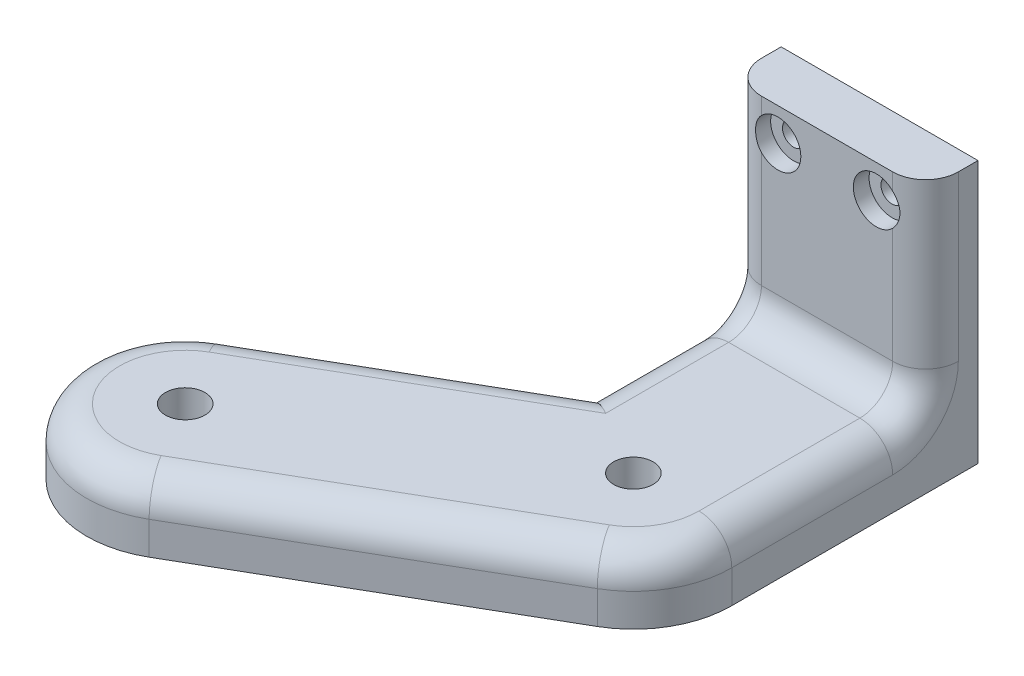
ISO-10303-21;
HEADER;
FILE_DESCRIPTION(('STEP AP214'),'2;1');
FILE_NAME('part.step','',(''),(''),'','','');
FILE_SCHEMA(('AUTOMOTIVE_DESIGN { 1 0 10303 214 1 1 1 1 }'));
ENDSEC;
DATA;
#1=APPLICATION_CONTEXT('core data for automotive mechanical design processes');
#2=APPLICATION_PROTOCOL_DEFINITION('international standard','automotive_design',2000,#1);
#3=PRODUCT_CONTEXT('',#1,'mechanical');
#4=PRODUCT('Part','Part','',(#3));
#5=PRODUCT_RELATED_PRODUCT_CATEGORY('part','',(#4));
#6=PRODUCT_DEFINITION_FORMATION('','',#4);
#7=PRODUCT_DEFINITION_CONTEXT('part definition',#1,'design');
#8=PRODUCT_DEFINITION('design','',#6,#7);
#9=PRODUCT_DEFINITION_SHAPE('','',#8);
#10=(LENGTH_UNIT() NAMED_UNIT(*) SI_UNIT(.MILLI.,.METRE.));
#11=(NAMED_UNIT(*) PLANE_ANGLE_UNIT() SI_UNIT($,.RADIAN.));
#12=(NAMED_UNIT(*) SI_UNIT($,.STERADIAN.) SOLID_ANGLE_UNIT());
#13=UNCERTAINTY_MEASURE_WITH_UNIT(LENGTH_MEASURE(1.E-05),#10,'distance_accuracy_value','');
#14=(GEOMETRIC_REPRESENTATION_CONTEXT(3) GLOBAL_UNCERTAINTY_ASSIGNED_CONTEXT((#13)) GLOBAL_UNIT_ASSIGNED_CONTEXT((#10,
#11,#12)) REPRESENTATION_CONTEXT('',''));
#15=CARTESIAN_POINT('',(0.,0.,0.));
#16=DIRECTION('',(0.,0.,1.));
#17=DIRECTION('',(1.,0.,0.));
#18=AXIS2_PLACEMENT_3D('',#15,#16,#17);
#19=CARTESIAN_POINT('',(0.,5.,37.5217));
#20=DIRECTION('',(0.,-1.,0.));
#21=DIRECTION('',(0.,0.,-1.));
#22=AXIS2_PLACEMENT_3D('',#19,#20,#21);
#23=CYLINDRICAL_SURFACE('',#22,2.99999999999999);
#24=CARTESIAN_POINT('',(0.,5.,37.5217));
#25=DIRECTION('',(0.,1.,0.));
#26=DIRECTION('',(0.,0.,1.));
#27=AXIS2_PLACEMENT_3D('',#24,#25,#26);
#28=CIRCLE('',#27,2.99999999999999);
#29=CARTESIAN_POINT('',(0.,5.,40.5217));
#30=VERTEX_POINT('',#29);
#31=EDGE_CURVE('E200',#30,#30,#28,.T.);
#32=ORIENTED_EDGE('',*,*,#31,.T.);
#33=EDGE_LOOP('',(#32));
#34=FACE_BOUND('',#33,.T.);
#35=CARTESIAN_POINT('',(0.,0.,37.5217));
#36=DIRECTION('',(0.,-1.,0.));
#37=DIRECTION('',(0.,0.,-1.));
#38=AXIS2_PLACEMENT_3D('',#35,#36,#37);
#39=CIRCLE('',#38,2.99999999999999);
#40=CARTESIAN_POINT('',(0.,0.,34.5217));
#41=VERTEX_POINT('',#40);
#42=EDGE_CURVE('E234',#41,#41,#39,.T.);
#43=ORIENTED_EDGE('',*,*,#42,.T.);
#44=EDGE_LOOP('',(#43));
#45=FACE_BOUND('',#44,.T.);
#46=ADVANCED_FACE('F39',(#34,#45),#23,.F.);
#47=CARTESIAN_POINT('',(-43.3012701892221,5.,62.5216999999997));
#48=DIRECTION('',(0.,1.,0.));
#49=DIRECTION('',(0.,0.,1.));
#50=AXIS2_PLACEMENT_3D('',#47,#48,#49);
#51=PLANE('',#50);
#52=DIRECTION('',(0.,0.,-1.));
#53=VECTOR('',#52,1.);
#54=CARTESIAN_POINT('',(9.99999999999999,5.,8.));
#55=LINE('',#54,#53);
#56=CARTESIAN_POINT('',(9.99999999999999,5.,37.5217));
#57=VERTEX_POINT('',#56);
#58=CARTESIAN_POINT('',(9.99999999999999,5.,13.));
#59=VERTEX_POINT('',#58);
#60=EDGE_CURVE('E354',#57,#59,#55,.T.);
#61=ORIENTED_EDGE('',*,*,#60,.T.);
#62=DIRECTION('',(-1.,0.,0.));
#63=VECTOR('',#62,1.);
#64=CARTESIAN_POINT('',(-15.,5.,13.));
#65=LINE('',#64,#63);
#66=CARTESIAN_POINT('',(-10.,5.,13.));
#67=VERTEX_POINT('',#66);
#68=EDGE_CURVE('E468',#59,#67,#65,.T.);
#69=ORIENTED_EDGE('',*,*,#68,.T.);
#70=DIRECTION('',(0.,0.,1.));
#71=VECTOR('',#70,1.);
#72=CARTESIAN_POINT('',(-10.,5.,28.8614459621556));
#73=LINE('',#72,#71);
#74=CARTESIAN_POINT('',(-10.,5.,31.7481973081037));
#75=VERTEX_POINT('',#74);
#76=EDGE_CURVE('E477',#67,#75,#73,.T.);
#77=ORIENTED_EDGE('',*,*,#76,.T.);
#78=DIRECTION('',(-0.866025403784441,0.,0.499999999999995));
#79=VECTOR('',#78,1.);
#80=CARTESIAN_POINT('',(-48.301270189222,5.,53.8614459621553));
#81=LINE('',#80,#79);
#82=CARTESIAN_POINT('',(-48.301270189222,5.,53.8614459621553));
#83=VERTEX_POINT('',#82);
#84=EDGE_CURVE('E479',#75,#83,#81,.T.);
#85=ORIENTED_EDGE('',*,*,#84,.T.);
#86=CARTESIAN_POINT('',(-43.3012701892221,5.,62.5216999999997));
#87=DIRECTION('',(0.,1.,0.));
#88=DIRECTION('',(0.,0.,1.));
#89=AXIS2_PLACEMENT_3D('',#86,#87,#88);
#90=CIRCLE('',#89,9.99999999999999);
#91=CARTESIAN_POINT('',(-38.3012701892221,5.,71.1819540378442));
#92=VERTEX_POINT('',#91);
#93=EDGE_CURVE('E482',#83,#92,#90,.T.);
#94=ORIENTED_EDGE('',*,*,#93,.T.);
#95=DIRECTION('',(0.866025403784442,0.,-0.499999999999995));
#96=VECTOR('',#95,1.);
#97=CARTESIAN_POINT('',(4.99999999999996,5.,46.1819540378444));
#98=LINE('',#97,#96);
#99=CARTESIAN_POINT('',(4.99999999999994,5.,46.1819540378444));
#100=VERTEX_POINT('',#99);
#101=EDGE_CURVE('E484',#92,#100,#98,.T.);
#102=ORIENTED_EDGE('',*,*,#101,.T.);
#103=CARTESIAN_POINT('',(0.,5.,37.5217));
#104=DIRECTION('',(0.,1.,0.));
#105=DIRECTION('',(0.,0.,1.));
#106=AXIS2_PLACEMENT_3D('',#103,#104,#105);
#107=CIRCLE('',#106,9.99999999999998);
#108=EDGE_CURVE('E434',#100,#57,#107,.T.);
#109=ORIENTED_EDGE('',*,*,#108,.T.);
#110=EDGE_LOOP('',(#61,#69,#77,#85,#94,#102,#109));
#111=FACE_BOUND('',#110,.T.);
#112=ORIENTED_EDGE('',*,*,#31,.F.);
#113=EDGE_LOOP('',(#112));
#114=FACE_BOUND('',#113,.T.);
#115=CARTESIAN_POINT('',(-43.3012701892221,5.,62.5216999999997));
#116=DIRECTION('',(0.,1.,0.));
#117=DIRECTION('',(0.,0.,1.));
#118=AXIS2_PLACEMENT_3D('',#115,#116,#117);
#119=CIRCLE('',#118,3.);
#120=CARTESIAN_POINT('',(-43.3012701892221,5.,65.5216999999998));
#121=VERTEX_POINT('',#120);
#122=EDGE_CURVE('E197',#121,#121,#119,.T.);
#123=ORIENTED_EDGE('',*,*,#122,.F.);
#124=EDGE_LOOP('',(#123));
#125=FACE_BOUND('',#124,.T.);
#126=ADVANCED_FACE('F299',(#111,#114,#125),#51,.T.);
#127=CARTESIAN_POINT('',(-43.3012701892221,-5.,62.5216999999997));
#128=DIRECTION('',(0.,1.,0.));
#129=DIRECTION('',(0.,0.,1.));
#130=AXIS2_PLACEMENT_3D('',#127,#128,#129);
#131=PLANE('',#130);
#132=CARTESIAN_POINT('',(0.,-5.,37.5217));
#133=DIRECTION('',(0.,-1.,0.));
#134=DIRECTION('',(0.,0.,-1.));
#135=AXIS2_PLACEMENT_3D('',#132,#133,#134);
#136=CIRCLE('',#135,6.5);
#137=CARTESIAN_POINT('',(0.,-5.,31.0217));
#138=VERTEX_POINT('',#137);
#139=EDGE_CURVE('E379',#138,#138,#136,.T.);
#140=ORIENTED_EDGE('',*,*,#139,.F.);
#141=EDGE_LOOP('',(#140));
#142=FACE_BOUND('',#141,.T.);
#143=DIRECTION('',(0.,0.,-1.));
#144=VECTOR('',#143,1.);
#145=CARTESIAN_POINT('',(15.,-5.,37.5217));
#146=LINE('',#145,#144);
#147=CARTESIAN_POINT('',(15.,-5.,37.5217));
#148=VERTEX_POINT('',#147);
#149=CARTESIAN_POINT('',(15.,-5.,0.));
#150=VERTEX_POINT('',#149);
#151=EDGE_CURVE('E205',#148,#150,#146,.T.);
#152=ORIENTED_EDGE('',*,*,#151,.F.);
#153=CARTESIAN_POINT('',(0.,-5.,37.5217));
#154=DIRECTION('',(0.,1.,0.));
#155=DIRECTION('',(0.,0.,1.));
#156=AXIS2_PLACEMENT_3D('',#153,#154,#155);
#157=CIRCLE('',#156,15.);
#158=CARTESIAN_POINT('',(7.49999999999992,-5.,50.5120810567666));
#159=VERTEX_POINT('',#158);
#160=EDGE_CURVE('E220',#159,#148,#157,.T.);
#161=ORIENTED_EDGE('',*,*,#160,.F.);
#162=DIRECTION('',(0.866025403784442,0.,-0.499999999999995));
#163=VECTOR('',#162,1.);
#164=CARTESIAN_POINT('',(7.49999999999992,-5.,50.5120810567666));
#165=LINE('',#164,#163);
#166=CARTESIAN_POINT('',(-35.8012701892222,-5.,75.5120810567664));
#167=VERTEX_POINT('',#166);
#168=EDGE_CURVE('E217',#167,#159,#165,.T.);
#169=ORIENTED_EDGE('',*,*,#168,.F.);
#170=CARTESIAN_POINT('',(-43.3012701892221,-5.,62.5216999999997));
#171=DIRECTION('',(0.,1.,0.));
#172=DIRECTION('',(0.,0.,1.));
#173=AXIS2_PLACEMENT_3D('',#170,#171,#172);
#174=CIRCLE('',#173,15.);
#175=CARTESIAN_POINT('',(-50.801270189222,-5.,49.5313189432331));
#176=VERTEX_POINT('',#175);
#177=EDGE_CURVE('E214',#176,#167,#174,.T.);
#178=ORIENTED_EDGE('',*,*,#177,.F.);
#179=DIRECTION('',(-0.866025403784441,0.,0.499999999999995));
#180=VECTOR('',#179,1.);
#181=CARTESIAN_POINT('',(-15.,-5.,28.8614459621556));
#182=LINE('',#181,#180);
#183=CARTESIAN_POINT('',(-15.,-5.,28.8614459621556));
#184=VERTEX_POINT('',#183);
#185=EDGE_CURVE('E211',#184,#176,#182,.T.);
#186=ORIENTED_EDGE('',*,*,#185,.F.);
#187=DIRECTION('',(0.,0.,1.));
#188=VECTOR('',#187,1.);
#189=CARTESIAN_POINT('',(-15.,-5.,0.));
#190=LINE('',#189,#188);
#191=CARTESIAN_POINT('',(-15.,-5.,0.));
#192=VERTEX_POINT('',#191);
#193=EDGE_CURVE('E209',#192,#184,#190,.T.);
#194=ORIENTED_EDGE('',*,*,#193,.F.);
#195=DIRECTION('',(-1.,0.,0.));
#196=VECTOR('',#195,1.);
#197=CARTESIAN_POINT('',(-15.,-5.,0.));
#198=LINE('',#197,#196);
#199=EDGE_CURVE('E180',#150,#192,#198,.T.);
#200=ORIENTED_EDGE('',*,*,#199,.F.);
#201=EDGE_LOOP('',(#152,#161,#169,#178,#186,#194,#200));
#202=FACE_BOUND('',#201,.T.);
#203=CARTESIAN_POINT('',(-43.3012701892221,-5.,62.5216999999997));
#204=DIRECTION('',(0.,1.,0.));
#205=DIRECTION('',(0.,0.,1.));
#206=AXIS2_PLACEMENT_3D('',#203,#204,#205);
#207=CIRCLE('',#206,3.);
#208=CARTESIAN_POINT('',(-43.3012701892221,-5.,65.5216999999998));
#209=VERTEX_POINT('',#208);
#210=EDGE_CURVE('E195',#209,#209,#207,.T.);
#211=ORIENTED_EDGE('',*,*,#210,.T.);
#212=EDGE_LOOP('',(#211));
#213=FACE_BOUND('',#212,.T.);
#214=ADVANCED_FACE('F303',(#142,#202,#213),#131,.F.);
#215=CARTESIAN_POINT('',(15.,5.,37.5217));
#216=DIRECTION('',(-1.,0.,0.));
#217=DIRECTION('',(0.,0.,1.));
#218=AXIS2_PLACEMENT_3D('',#215,#216,#217);
#219=PLANE('',#218);
#220=DIRECTION('',(0.,0.,-1.));
#221=VECTOR('',#220,1.);
#222=CARTESIAN_POINT('',(15.,35.,8.));
#223=LINE('',#222,#221);
#224=CARTESIAN_POINT('',(15.,35.,3.));
#225=VERTEX_POINT('',#224);
#226=CARTESIAN_POINT('',(15.,35.,0.));
#227=VERTEX_POINT('',#226);
#228=EDGE_CURVE('E172',#225,#227,#223,.T.);
#229=ORIENTED_EDGE('',*,*,#228,.F.);
#230=DIRECTION('',(0.,-1.,0.));
#231=VECTOR('',#230,1.);
#232=CARTESIAN_POINT('',(15.,5.,3.));
#233=LINE('',#232,#231);
#234=CARTESIAN_POINT('',(15.,10.,3.));
#235=VERTEX_POINT('',#234);
#236=EDGE_CURVE('E243',#225,#235,#233,.T.);
#237=ORIENTED_EDGE('',*,*,#236,.T.);
#238=CARTESIAN_POINT('',(15.,10.,13.));
#239=DIRECTION('',(-1.,0.,0.));
#240=DIRECTION('',(0.,0.,1.));
#241=AXIS2_PLACEMENT_3D('',#238,#239,#240);
#242=CIRCLE('',#241,10.);
#243=CARTESIAN_POINT('',(15.,0.,13.));
#244=VERTEX_POINT('',#243);
#245=EDGE_CURVE('E240',#244,#235,#242,.F.);
#246=ORIENTED_EDGE('',*,*,#245,.F.);
#247=DIRECTION('',(0.,0.,-1.));
#248=VECTOR('',#247,1.);
#249=CARTESIAN_POINT('',(15.,0.,37.5217));
#250=LINE('',#249,#248);
#251=CARTESIAN_POINT('',(15.,0.,37.5217));
#252=VERTEX_POINT('',#251);
#253=EDGE_CURVE('E233',#244,#252,#250,.F.);
#254=ORIENTED_EDGE('',*,*,#253,.T.);
#255=DIRECTION('',(0.,-1.,0.));
#256=VECTOR('',#255,1.);
#257=CARTESIAN_POINT('',(15.,5.,37.5217));
#258=LINE('',#257,#256);
#259=EDGE_CURVE('E223',#252,#148,#258,.T.);
#260=ORIENTED_EDGE('',*,*,#259,.T.);
#261=ORIENTED_EDGE('',*,*,#151,.T.);
#262=DIRECTION('',(0.,-1.,0.));
#263=VECTOR('',#262,1.);
#264=CARTESIAN_POINT('',(15.,5.,0.));
#265=LINE('',#264,#263);
#266=EDGE_CURVE('E181',#227,#150,#265,.T.);
#267=ORIENTED_EDGE('',*,*,#266,.F.);
#268=EDGE_LOOP('',(#229,#237,#246,#254,#260,#261,#267));
#269=FACE_BOUND('',#268,.T.);
#270=ADVANCED_FACE('F307',(#269),#219,.F.);
#271=CARTESIAN_POINT('',(-15.,5.,0.));
#272=DIRECTION('',(0.,0.,1.));
#273=DIRECTION('',(1.,0.,0.));
#274=AXIS2_PLACEMENT_3D('',#271,#272,#273);
#275=PLANE('',#274);
#276=CARTESIAN_POINT('',(-7.5,30.,0.));
#277=DIRECTION('',(0.,0.,1.));
#278=DIRECTION('',(1.,0.,0.));
#279=AXIS2_PLACEMENT_3D('',#276,#277,#278);
#280=CIRCLE('',#279,1.7);
#281=CARTESIAN_POINT('',(-5.8,30.,0.));
#282=VERTEX_POINT('',#281);
#283=EDGE_CURVE('E400',#282,#282,#280,.T.);
#284=ORIENTED_EDGE('',*,*,#283,.T.);
#285=EDGE_LOOP('',(#284));
#286=FACE_BOUND('',#285,.T.);
#287=CARTESIAN_POINT('',(7.5,30.,0.));
#288=DIRECTION('',(0.,0.,1.));
#289=DIRECTION('',(1.,0.,0.));
#290=AXIS2_PLACEMENT_3D('',#287,#288,#289);
#291=CIRCLE('',#290,1.7);
#292=CARTESIAN_POINT('',(9.2,30.,0.));
#293=VERTEX_POINT('',#292);
#294=EDGE_CURVE('E188',#293,#293,#291,.T.);
#295=ORIENTED_EDGE('',*,*,#294,.T.);
#296=EDGE_LOOP('',(#295));
#297=FACE_BOUND('',#296,.T.);
#298=ORIENTED_EDGE('',*,*,#199,.T.);
#299=DIRECTION('',(0.,-1.,0.));
#300=VECTOR('',#299,1.);
#301=CARTESIAN_POINT('',(-15.,5.,0.));
#302=LINE('',#301,#300);
#303=CARTESIAN_POINT('',(-15.,35.,0.));
#304=VERTEX_POINT('',#303);
#305=EDGE_CURVE('E165',#304,#192,#302,.T.);
#306=ORIENTED_EDGE('',*,*,#305,.F.);
#307=DIRECTION('',(1.,0.,0.));
#308=VECTOR('',#307,1.);
#309=CARTESIAN_POINT('',(15.,35.,0.));
#310=LINE('',#309,#308);
#311=EDGE_CURVE('E179',#304,#227,#310,.T.);
#312=ORIENTED_EDGE('',*,*,#311,.T.);
#313=ORIENTED_EDGE('',*,*,#266,.T.);
#314=EDGE_LOOP('',(#298,#306,#312,#313));
#315=FACE_BOUND('',#314,.T.);
#316=ADVANCED_FACE('F177',(#286,#297,#315),#275,.F.);
#317=CARTESIAN_POINT('',(-15.,5.,0.));
#318=DIRECTION('',(1.,0.,0.));
#319=DIRECTION('',(0.,0.,-1.));
#320=AXIS2_PLACEMENT_3D('',#317,#318,#319);
#321=PLANE('',#320);
#322=CARTESIAN_POINT('',(-15.,10.,13.));
#323=DIRECTION('',(1.,0.,0.));
#324=DIRECTION('',(0.,0.,-1.));
#325=AXIS2_PLACEMENT_3D('',#322,#323,#324);
#326=CIRCLE('',#325,10.);
#327=CARTESIAN_POINT('',(-15.,10.,3.));
#328=VERTEX_POINT('',#327);
#329=CARTESIAN_POINT('',(-15.,0.,13.));
#330=VERTEX_POINT('',#329);
#331=EDGE_CURVE('E419',#328,#330,#326,.F.);
#332=ORIENTED_EDGE('',*,*,#331,.F.);
#333=DIRECTION('',(0.,1.,0.));
#334=VECTOR('',#333,1.);
#335=CARTESIAN_POINT('',(-15.,35.,3.));
#336=LINE('',#335,#334);
#337=CARTESIAN_POINT('',(-15.,35.,3.));
#338=VERTEX_POINT('',#337);
#339=EDGE_CURVE('E168',#328,#338,#336,.T.);
#340=ORIENTED_EDGE('',*,*,#339,.T.);
#341=DIRECTION('',(0.,0.,-1.));
#342=VECTOR('',#341,1.);
#343=CARTESIAN_POINT('',(-15.,35.,8.));
#344=LINE('',#343,#342);
#345=EDGE_CURVE('E161',#338,#304,#344,.T.);
#346=ORIENTED_EDGE('',*,*,#345,.T.);
#347=ORIENTED_EDGE('',*,*,#305,.T.);
#348=ORIENTED_EDGE('',*,*,#193,.T.);
#349=DIRECTION('',(0.,-1.,0.));
#350=VECTOR('',#349,1.);
#351=CARTESIAN_POINT('',(-15.,5.,28.8614459621556));
#352=LINE('',#351,#350);
#353=CARTESIAN_POINT('',(-15.,0.,28.8614459621556));
#354=VERTEX_POINT('',#353);
#355=EDGE_CURVE('E182',#354,#184,#352,.T.);
#356=ORIENTED_EDGE('',*,*,#355,.F.);
#357=DIRECTION('',(0.,0.,1.));
#358=VECTOR('',#357,1.);
#359=CARTESIAN_POINT('',(-15.,0.,8.));
#360=LINE('',#359,#358);
#361=EDGE_CURVE('E421',#354,#330,#360,.F.);
#362=ORIENTED_EDGE('',*,*,#361,.T.);
#363=EDGE_LOOP('',(#332,#340,#346,#347,#348,#356,#362));
#364=FACE_BOUND('',#363,.T.);
#365=ADVANCED_FACE('F163',(#364),#321,.F.);
#366=CARTESIAN_POINT('',(-15.,5.,28.8614459621556));
#367=DIRECTION('',(0.499999999999995,0.,0.866025403784441));
#368=DIRECTION('',(0.866025403784441,0.,-0.499999999999995));
#369=AXIS2_PLACEMENT_3D('',#366,#367,#368);
#370=PLANE('',#369);
#371=DIRECTION('',(0.,-1.,0.));
#372=VECTOR('',#371,1.);
#373=CARTESIAN_POINT('',(-50.801270189222,5.,49.5313189432331));
#374=LINE('',#373,#372);
#375=CARTESIAN_POINT('',(-50.801270189222,0.,49.5313189432331));
#376=VERTEX_POINT('',#375);
#377=EDGE_CURVE('E229',#376,#176,#374,.T.);
#378=ORIENTED_EDGE('',*,*,#377,.F.);
#379=DIRECTION('',(-0.866025403784441,0.,0.499999999999995));
#380=VECTOR('',#379,1.);
#381=CARTESIAN_POINT('',(-15.,0.,28.8614459621556));
#382=LINE('',#381,#380);
#383=EDGE_CURVE('E474',#376,#354,#382,.F.);
#384=ORIENTED_EDGE('',*,*,#383,.T.);
#385=ORIENTED_EDGE('',*,*,#355,.T.);
#386=ORIENTED_EDGE('',*,*,#185,.T.);
#387=EDGE_LOOP('',(#378,#384,#385,#386));
#388=FACE_BOUND('',#387,.T.);
#389=ADVANCED_FACE('F317',(#388),#370,.F.);
#390=CARTESIAN_POINT('',(-43.3012701892221,5.,62.5216999999997));
#391=DIRECTION('',(0.,-1.,0.));
#392=DIRECTION('',(0.,0.,-1.));
#393=AXIS2_PLACEMENT_3D('',#390,#391,#392);
#394=CYLINDRICAL_SURFACE('',#393,15.);
#395=DIRECTION('',(0.,-1.,0.));
#396=VECTOR('',#395,1.);
#397=CARTESIAN_POINT('',(-35.8012701892222,5.,75.5120810567664));
#398=LINE('',#397,#396);
#399=CARTESIAN_POINT('',(-35.8012701892222,0.,75.5120810567664));
#400=VERTEX_POINT('',#399);
#401=EDGE_CURVE('E227',#400,#167,#398,.T.);
#402=ORIENTED_EDGE('',*,*,#401,.F.);
#403=CARTESIAN_POINT('',(-43.3012701892221,0.,62.5216999999997));
#404=DIRECTION('',(0.,1.,0.));
#405=DIRECTION('',(0.,0.,1.));
#406=AXIS2_PLACEMENT_3D('',#403,#404,#405);
#407=CIRCLE('',#406,15.);
#408=EDGE_CURVE('E472',#400,#376,#407,.F.);
#409=ORIENTED_EDGE('',*,*,#408,.T.);
#410=ORIENTED_EDGE('',*,*,#377,.T.);
#411=ORIENTED_EDGE('',*,*,#177,.T.);
#412=EDGE_LOOP('',(#402,#409,#410,#411));
#413=FACE_BOUND('',#412,.T.);
#414=ADVANCED_FACE('F314',(#413),#394,.T.);
#415=CARTESIAN_POINT('',(7.49999999999992,5.,50.5120810567666));
#416=DIRECTION('',(-0.499999999999995,0.,-0.866025403784442));
#417=DIRECTION('',(-0.866025403784442,0.,0.499999999999995));
#418=AXIS2_PLACEMENT_3D('',#415,#416,#417);
#419=PLANE('',#418);
#420=DIRECTION('',(0.,-1.,0.));
#421=VECTOR('',#420,1.);
#422=CARTESIAN_POINT('',(7.49999999999992,5.,50.5120810567666));
#423=LINE('',#422,#421);
#424=CARTESIAN_POINT('',(7.49999999999992,0.,50.5120810567666));
#425=VERTEX_POINT('',#424);
#426=EDGE_CURVE('E225',#425,#159,#423,.T.);
#427=ORIENTED_EDGE('',*,*,#426,.F.);
#428=DIRECTION('',(0.866025403784442,0.,-0.499999999999995));
#429=VECTOR('',#428,1.);
#430=CARTESIAN_POINT('',(-35.8012701892222,0.,75.5120810567664));
#431=LINE('',#430,#429);
#432=EDGE_CURVE('E48',#425,#400,#431,.F.);
#433=ORIENTED_EDGE('',*,*,#432,.T.);
#434=ORIENTED_EDGE('',*,*,#401,.T.);
#435=ORIENTED_EDGE('',*,*,#168,.T.);
#436=EDGE_LOOP('',(#427,#433,#434,#435));
#437=FACE_BOUND('',#436,.T.);
#438=ADVANCED_FACE('F311',(#437),#419,.F.);
#439=CARTESIAN_POINT('',(0.,5.,37.5217));
#440=DIRECTION('',(0.,-1.,0.));
#441=DIRECTION('',(0.,0.,-1.));
#442=AXIS2_PLACEMENT_3D('',#439,#440,#441);
#443=CYLINDRICAL_SURFACE('',#442,15.);
#444=ORIENTED_EDGE('',*,*,#259,.F.);
#445=CARTESIAN_POINT('',(0.,0.,37.5217));
#446=DIRECTION('',(0.,1.,0.));
#447=DIRECTION('',(0.,0.,1.));
#448=AXIS2_PLACEMENT_3D('',#445,#446,#447);
#449=CIRCLE('',#448,15.);
#450=EDGE_CURVE('E11',#252,#425,#449,.F.);
#451=ORIENTED_EDGE('',*,*,#450,.T.);
#452=ORIENTED_EDGE('',*,*,#426,.T.);
#453=ORIENTED_EDGE('',*,*,#160,.T.);
#454=EDGE_LOOP('',(#444,#451,#452,#453));
#455=FACE_BOUND('',#454,.T.);
#456=ADVANCED_FACE('F295',(#455),#443,.T.);
#457=CARTESIAN_POINT('',(-43.3012701892221,5.,62.5216999999997));
#458=DIRECTION('',(0.,-1.,0.));
#459=DIRECTION('',(0.,0.,-1.));
#460=AXIS2_PLACEMENT_3D('',#457,#458,#459);
#461=CYLINDRICAL_SURFACE('',#460,3.);
#462=ORIENTED_EDGE('',*,*,#122,.T.);
#463=EDGE_LOOP('',(#462));
#464=FACE_BOUND('',#463,.T.);
#465=ORIENTED_EDGE('',*,*,#210,.F.);
#466=EDGE_LOOP('',(#465));
#467=FACE_BOUND('',#466,.T.);
#468=ADVANCED_FACE('F292',(#464,#467),#461,.F.);
#469=CARTESIAN_POINT('',(15.,35.,8.));
#470=DIRECTION('',(0.,1.,0.));
#471=DIRECTION('',(-1.,0.,0.));
#472=AXIS2_PLACEMENT_3D('',#469,#470,#471);
#473=PLANE('',#472);
#474=DIRECTION('',(1.,0.,0.));
#475=VECTOR('',#474,1.);
#476=CARTESIAN_POINT('',(15.,35.,8.));
#477=LINE('',#476,#475);
#478=CARTESIAN_POINT('',(-10.,35.,8.));
#479=VERTEX_POINT('',#478);
#480=CARTESIAN_POINT('',(9.99999999999999,35.,8.));
#481=VERTEX_POINT('',#480);
#482=EDGE_CURVE('E173',#479,#481,#477,.T.);
#483=ORIENTED_EDGE('',*,*,#482,.T.);
#484=CARTESIAN_POINT('',(9.99999999999999,35.,3.));
#485=DIRECTION('',(0.,1.,0.));
#486=DIRECTION('',(-1.,0.,0.));
#487=AXIS2_PLACEMENT_3D('',#484,#485,#486);
#488=CIRCLE('',#487,5.);
#489=EDGE_CURVE('E335',#481,#225,#488,.T.);
#490=ORIENTED_EDGE('',*,*,#489,.T.);
#491=ORIENTED_EDGE('',*,*,#228,.T.);
#492=ORIENTED_EDGE('',*,*,#311,.F.);
#493=ORIENTED_EDGE('',*,*,#345,.F.);
#494=CARTESIAN_POINT('',(-10.,35.,3.));
#495=DIRECTION('',(0.,1.,0.));
#496=DIRECTION('',(-1.,0.,0.));
#497=AXIS2_PLACEMENT_3D('',#494,#495,#496);
#498=CIRCLE('',#497,5.);
#499=EDGE_CURVE('E264',#338,#479,#498,.T.);
#500=ORIENTED_EDGE('',*,*,#499,.T.);
#501=EDGE_LOOP('',(#483,#490,#491,#492,#493,#500));
#502=FACE_BOUND('',#501,.T.);
#503=ADVANCED_FACE('F185',(#502),#473,.T.);
#504=CARTESIAN_POINT('',(0.,0.,8.));
#505=DIRECTION('',(0.,0.,1.));
#506=DIRECTION('',(1.,0.,0.));
#507=AXIS2_PLACEMENT_3D('',#504,#505,#506);
#508=PLANE('',#507);
#509=CARTESIAN_POINT('',(7.5,30.,8.));
#510=DIRECTION('',(0.,0.,1.));
#511=DIRECTION('',(1.,0.,0.));
#512=AXIS2_PLACEMENT_3D('',#509,#510,#511);
#513=CIRCLE('',#512,3.5);
#514=CARTESIAN_POINT('',(9.99999999999999,32.4494897427832,8.));
#515=VERTEX_POINT('',#514);
#516=CARTESIAN_POINT('',(9.99999999999999,27.5505102572168,8.));
#517=VERTEX_POINT('',#516);
#518=EDGE_CURVE('E403',#515,#517,#513,.T.);
#519=ORIENTED_EDGE('',*,*,#518,.F.);
#520=DIRECTION('',(0.,-1.,0.));
#521=VECTOR('',#520,1.);
#522=CARTESIAN_POINT('',(9.99999999999999,35.,8.));
#523=LINE('',#522,#521);
#524=EDGE_CURVE('E254',#515,#481,#523,.F.);
#525=ORIENTED_EDGE('',*,*,#524,.T.);
#526=ORIENTED_EDGE('',*,*,#482,.F.);
#527=DIRECTION('',(0.,1.,0.));
#528=VECTOR('',#527,1.);
#529=CARTESIAN_POINT('',(-10.,5.,8.));
#530=LINE('',#529,#528);
#531=CARTESIAN_POINT('',(-10.,32.4494897427832,8.));
#532=VERTEX_POINT('',#531);
#533=EDGE_CURVE('E252',#479,#532,#530,.F.);
#534=ORIENTED_EDGE('',*,*,#533,.T.);
#535=CARTESIAN_POINT('',(-7.5,30.,8.));
#536=DIRECTION('',(0.,0.,1.));
#537=DIRECTION('',(1.,0.,0.));
#538=AXIS2_PLACEMENT_3D('',#535,#536,#537);
#539=CIRCLE('',#538,3.5);
#540=CARTESIAN_POINT('',(-10.,27.5505102572168,8.));
#541=VERTEX_POINT('',#540);
#542=EDGE_CURVE('E237',#541,#532,#539,.T.);
#543=ORIENTED_EDGE('',*,*,#542,.F.);
#544=DIRECTION('',(0.,1.,0.));
#545=VECTOR('',#544,1.);
#546=CARTESIAN_POINT('',(-10.,5.,8.));
#547=LINE('',#546,#545);
#548=CARTESIAN_POINT('',(-10.,10.,8.));
#549=VERTEX_POINT('',#548);
#550=EDGE_CURVE('E248',#541,#549,#547,.F.);
#551=ORIENTED_EDGE('',*,*,#550,.T.);
#552=DIRECTION('',(-1.,0.,0.));
#553=VECTOR('',#552,1.);
#554=CARTESIAN_POINT('',(15.,10.,8.));
#555=LINE('',#554,#553);
#556=CARTESIAN_POINT('',(9.99999999999999,10.,8.));
#557=VERTEX_POINT('',#556);
#558=EDGE_CURVE('E246',#549,#557,#555,.F.);
#559=ORIENTED_EDGE('',*,*,#558,.T.);
#560=DIRECTION('',(0.,-1.,0.));
#561=VECTOR('',#560,1.);
#562=CARTESIAN_POINT('',(9.99999999999999,35.,8.));
#563=LINE('',#562,#561);
#564=EDGE_CURVE('E250',#557,#517,#563,.F.);
#565=ORIENTED_EDGE('',*,*,#564,.T.);
#566=EDGE_LOOP('',(#519,#525,#526,#534,#543,#551,#559,#565));
#567=FACE_BOUND('',#566,.T.);
#568=ADVANCED_FACE('F285',(#567),#508,.T.);
#569=CARTESIAN_POINT('',(7.5,30.,8.));
#570=DIRECTION('',(0.,0.,1.));
#571=DIRECTION('',(1.,0.,0.));
#572=AXIS2_PLACEMENT_3D('',#569,#570,#571);
#573=CYLINDRICAL_SURFACE('',#572,1.70000000000001);
#574=ORIENTED_EDGE('',*,*,#294,.F.);
#575=EDGE_LOOP('',(#574));
#576=FACE_BOUND('',#575,.T.);
#577=CARTESIAN_POINT('',(7.5,30.,5.6));
#578=DIRECTION('',(0.,0.,1.));
#579=DIRECTION('',(1.,0.,0.));
#580=AXIS2_PLACEMENT_3D('',#577,#578,#579);
#581=CIRCLE('',#580,1.70000000000001);
#582=CARTESIAN_POINT('',(9.20000000000002,30.,5.6));
#583=VERTEX_POINT('',#582);
#584=EDGE_CURVE('E192',#583,#583,#581,.T.);
#585=ORIENTED_EDGE('',*,*,#584,.T.);
#586=EDGE_LOOP('',(#585));
#587=FACE_BOUND('',#586,.T.);
#588=ADVANCED_FACE('F281',(#576,#587),#573,.F.);
#589=CARTESIAN_POINT('',(9.20000000000002,30.,5.6));
#590=DIRECTION('',(0.,0.,-1.));
#591=DIRECTION('',(-1.,0.,0.));
#592=AXIS2_PLACEMENT_3D('',#589,#590,#591);
#593=PLANE('',#592);
#594=ORIENTED_EDGE('',*,*,#584,.F.);
#595=EDGE_LOOP('',(#594));
#596=FACE_BOUND('',#595,.T.);
#597=CARTESIAN_POINT('',(7.5,30.,5.6));
#598=DIRECTION('',(0.,0.,1.));
#599=DIRECTION('',(1.,0.,0.));
#600=AXIS2_PLACEMENT_3D('',#597,#598,#599);
#601=CIRCLE('',#600,3.5);
#602=CARTESIAN_POINT('',(11.,30.,5.6));
#603=VERTEX_POINT('',#602);
#604=EDGE_CURVE('E406',#603,#603,#601,.T.);
#605=ORIENTED_EDGE('',*,*,#604,.T.);
#606=EDGE_LOOP('',(#605));
#607=FACE_BOUND('',#606,.T.);
#608=ADVANCED_FACE('F276',(#596,#607),#593,.F.);
#609=CARTESIAN_POINT('',(7.5,30.,8.));
#610=DIRECTION('',(0.,0.,1.));
#611=DIRECTION('',(1.,0.,0.));
#612=AXIS2_PLACEMENT_3D('',#609,#610,#611);
#613=CYLINDRICAL_SURFACE('',#612,3.5);
#614=ORIENTED_EDGE('',*,*,#604,.F.);
#615=EDGE_LOOP('',(#614));
#616=FACE_BOUND('',#615,.T.);
#617=ORIENTED_EDGE('',*,*,#518,.T.);
#618=CARTESIAN_POINT('',(9.99999999999999,27.5505102572168,8.));
#619=CARTESIAN_POINT('',(10.0685620482722,27.6204714562928,7.99999799187767));
#620=CARTESIAN_POINT('',(10.1341560017375,27.6933082892013,7.99858967885353));
#621=CARTESIAN_POINT('',(10.2589649247468,27.8441535669245,7.9936801305457));
#622=CARTESIAN_POINT('',(10.3181819921735,27.9221602972073,7.99017958606684));
#623=CARTESIAN_POINT('',(10.4298158018898,28.0827775806396,7.98180613888435));
#624=CARTESIAN_POINT('',(10.4822354993147,28.1653861106894,7.97693383548994));
#625=CARTESIAN_POINT('',(10.5799597774788,28.3346441140521,7.96649319924952));
#626=CARTESIAN_POINT('',(10.6252638771025,28.4212938600953,7.96092481938453));
#627=CARTESIAN_POINT('',(10.7500011302193,28.6863999537214,7.94414793803426));
#628=CARTESIAN_POINT('',(10.8183957179681,28.8702099569576,7.93285441914322));
#629=CARTESIAN_POINT('',(10.9235566277763,29.2466866103403,7.91425693391139));
#630=CARTESIAN_POINT('',(10.9603376789032,29.4393490919017,7.90695111024261));
#631=CARTESIAN_POINT('',(11.0012907238372,29.8287150930857,7.89876222882405));
#632=CARTESIAN_POINT('',(11.0053912216855,30.0254265293531,7.89789325340026));
#633=CARTESIAN_POINT('',(10.9806298320698,30.4167384244622,7.90290877527869));
#634=CARTESIAN_POINT('',(10.9517556791329,30.6113380706003,7.9087957855868));
#635=CARTESIAN_POINT('',(10.8625861916759,30.9901459733637,7.92523516876163));
#636=CARTESIAN_POINT('',(10.8027222864955,31.1744593632614,7.93572318951636));
#637=CARTESIAN_POINT('',(10.6534995669475,31.5305728817554,7.95767956030912));
#638=CARTESIAN_POINT('',(10.5641634407985,31.7023825121624,7.96914715124057));
#639=CARTESIAN_POINT('',(10.3950727204453,31.9707907147886,7.98480897657796));
#640=CARTESIAN_POINT('',(10.323232220299,32.0723873276451,7.99013911949716));
#641=CARTESIAN_POINT('',(10.1691943454356,32.2673419719669,7.99772932753663));
#642=CARTESIAN_POINT('',(10.0870079155554,32.3607085349933,7.99999260771718));
#643=CARTESIAN_POINT('',(9.99999999999998,32.4494897427832,8.));
#644=B_SPLINE_CURVE_WITH_KNOTS('',3,(#618,#619,#620,#621,#622,#623,#624,#625,#626,#627,#628,
#629,#630,#631,#632,#633,#634,#635,#636,#637,#638,#639,#640,#641,#642,#643),.UNSPECIFIED.,.F.,
.F.,(4,2,2,2,2,2,2,2,2,2,2,2,4),(0.,0.293735765435677,0.587374599873128,0.88088534466986,
1.17441592642667,1.76076640264265,2.34684354390817,2.93420250792078,3.52178002110536,
4.10138909059565,4.68055300427187,5.05350223415561,5.42606018982575),.UNSPECIFIED.);
#645=EDGE_CURVE('E256',#517,#515,#644,.T.);
#646=ORIENTED_EDGE('',*,*,#645,.T.);
#647=EDGE_LOOP('',(#617,#646));
#648=FACE_BOUND('',#647,.T.);
#649=ADVANCED_FACE('F270',(#616,#648),#613,.F.);
#650=CARTESIAN_POINT('',(-7.5,30.,8.));
#651=DIRECTION('',(0.,0.,1.));
#652=DIRECTION('',(1.,0.,0.));
#653=AXIS2_PLACEMENT_3D('',#650,#651,#652);
#654=CYLINDRICAL_SURFACE('',#653,1.70000000000001);
#655=ORIENTED_EDGE('',*,*,#283,.F.);
#656=EDGE_LOOP('',(#655));
#657=FACE_BOUND('',#656,.T.);
#658=CARTESIAN_POINT('',(-7.5,30.,5.6));
#659=DIRECTION('',(0.,0.,1.));
#660=DIRECTION('',(1.,0.,0.));
#661=AXIS2_PLACEMENT_3D('',#658,#659,#660);
#662=CIRCLE('',#661,1.70000000000001);
#663=CARTESIAN_POINT('',(-5.79999999999998,30.,5.6));
#664=VERTEX_POINT('',#663);
#665=EDGE_CURVE('E397',#664,#664,#662,.T.);
#666=ORIENTED_EDGE('',*,*,#665,.T.);
#667=EDGE_LOOP('',(#666));
#668=FACE_BOUND('',#667,.T.);
#669=ADVANCED_FACE('F275',(#657,#668),#654,.F.);
#670=CARTESIAN_POINT('',(-5.79999999999998,30.,5.6));
#671=DIRECTION('',(0.,0.,-1.));
#672=DIRECTION('',(-1.,0.,0.));
#673=AXIS2_PLACEMENT_3D('',#670,#671,#672);
#674=PLANE('',#673);
#675=ORIENTED_EDGE('',*,*,#665,.F.);
#676=EDGE_LOOP('',(#675));
#677=FACE_BOUND('',#676,.T.);
#678=CARTESIAN_POINT('',(-7.5,30.,5.6));
#679=DIRECTION('',(0.,0.,1.));
#680=DIRECTION('',(1.,0.,0.));
#681=AXIS2_PLACEMENT_3D('',#678,#679,#680);
#682=CIRCLE('',#681,3.5);
#683=CARTESIAN_POINT('',(-4.,30.,5.6));
#684=VERTEX_POINT('',#683);
#685=EDGE_CURVE('E394',#684,#684,#682,.T.);
#686=ORIENTED_EDGE('',*,*,#685,.T.);
#687=EDGE_LOOP('',(#686));
#688=FACE_BOUND('',#687,.T.);
#689=ADVANCED_FACE('F445',(#677,#688),#674,.F.);
#690=CARTESIAN_POINT('',(-7.5,30.,8.));
#691=DIRECTION('',(0.,0.,1.));
#692=DIRECTION('',(1.,0.,0.));
#693=AXIS2_PLACEMENT_3D('',#690,#691,#692);
#694=CYLINDRICAL_SURFACE('',#693,3.5);
#695=ORIENTED_EDGE('',*,*,#685,.F.);
#696=EDGE_LOOP('',(#695));
#697=FACE_BOUND('',#696,.T.);
#698=ORIENTED_EDGE('',*,*,#542,.T.);
#699=CARTESIAN_POINT('',(-10.,32.4494897427832,8.));
#700=CARTESIAN_POINT('',(-10.0685620482722,32.3795285437072,7.99999799187766));
#701=CARTESIAN_POINT('',(-10.1341560017375,32.3066917107987,7.99858967885353));
#702=CARTESIAN_POINT('',(-10.2589649247469,32.1558464330755,7.9936801305457));
#703=CARTESIAN_POINT('',(-10.3181819921735,32.0778397027926,7.99017958606684));
#704=CARTESIAN_POINT('',(-10.4298158018898,31.9172224193604,7.98180613888435));
#705=CARTESIAN_POINT('',(-10.4822354993148,31.8346138893105,7.97693383548994));
#706=CARTESIAN_POINT('',(-10.5799597774788,31.6653558859479,7.96649319924952));
#707=CARTESIAN_POINT('',(-10.6252638771025,31.5787061399047,7.96092481938453));
#708=CARTESIAN_POINT('',(-10.7500011302193,31.3136000462785,7.94414793803426));
#709=CARTESIAN_POINT('',(-10.8183957179681,31.1297900430424,7.93285441914322));
#710=CARTESIAN_POINT('',(-10.9235566277763,30.7533133896596,7.91425693391139));
#711=CARTESIAN_POINT('',(-10.9603376789032,30.5606509080982,7.90695111024261));
#712=CARTESIAN_POINT('',(-11.0012907238372,30.1712849069142,7.89876222882405));
#713=CARTESIAN_POINT('',(-11.0053912216855,29.9745734706469,7.89789325340026));
#714=CARTESIAN_POINT('',(-10.9806298320698,29.5832615755377,7.90290877527869));
#715=CARTESIAN_POINT('',(-10.9517556791329,29.3886619293996,7.9087957855868));
#716=CARTESIAN_POINT('',(-10.8625861916759,29.0098540266363,7.92523516876163));
#717=CARTESIAN_POINT('',(-10.8027222864955,28.8255406367385,7.93572318951637));
#718=CARTESIAN_POINT('',(-10.6534995669475,28.4694271182446,7.95767956030912));
#719=CARTESIAN_POINT('',(-10.5641634407985,28.2976174878375,7.96914715124058));
#720=CARTESIAN_POINT('',(-10.3950727204452,28.0292092852114,7.98480897657796));
#721=CARTESIAN_POINT('',(-10.3232322202989,27.9276126723549,7.99013911949716));
#722=CARTESIAN_POINT('',(-10.1691943454356,27.7326580280331,7.99772932753663));
#723=CARTESIAN_POINT('',(-10.0870079155554,27.6392914650067,7.99999260771718));
#724=CARTESIAN_POINT('',(-10.,27.5505102572168,8.));
#725=B_SPLINE_CURVE_WITH_KNOTS('',3,(#699,#700,#701,#702,#703,#704,#705,#706,#707,#708,#709,
#710,#711,#712,#713,#714,#715,#716,#717,#718,#719,#720,#721,#722,#723,#724),.UNSPECIFIED.,.F.,
.F.,(4,2,2,2,2,2,2,2,2,2,2,2,4),(0.,0.293735765435674,0.587374599873124,0.88088534466986,
1.17441592642666,1.76076640264264,2.34684354390816,2.93420250792077,3.52178002110535,
4.10138909059565,4.68055300427187,5.05350223415557,5.42606018982566),.UNSPECIFIED.);
#726=EDGE_CURVE('E426',#532,#541,#725,.T.);
#727=ORIENTED_EDGE('',*,*,#726,.T.);
#728=EDGE_LOOP('',(#698,#727));
#729=FACE_BOUND('',#728,.T.);
#730=ADVANCED_FACE('F440',(#697,#729),#694,.F.);
#731=CARTESIAN_POINT('',(0.,0.,37.5217));
#732=DIRECTION('',(0.,-1.,0.));
#733=DIRECTION('',(0.,0.,-1.));
#734=AXIS2_PLACEMENT_3D('',#731,#732,#733);
#735=CYLINDRICAL_SURFACE('',#734,6.5);
#736=CARTESIAN_POINT('',(0.,0.,37.5217));
#737=DIRECTION('',(0.,-1.,0.));
#738=DIRECTION('',(0.,0.,-1.));
#739=AXIS2_PLACEMENT_3D('',#736,#737,#738);
#740=CIRCLE('',#739,6.5);
#741=CARTESIAN_POINT('',(0.,0.,31.0217));
#742=VERTEX_POINT('',#741);
#743=EDGE_CURVE('E238',#742,#742,#740,.T.);
#744=ORIENTED_EDGE('',*,*,#743,.F.);
#745=EDGE_LOOP('',(#744));
#746=FACE_BOUND('',#745,.T.);
#747=ORIENTED_EDGE('',*,*,#139,.T.);
#748=EDGE_LOOP('',(#747));
#749=FACE_BOUND('',#748,.T.);
#750=ADVANCED_FACE('F444',(#746,#749),#735,.F.);
#751=CARTESIAN_POINT('',(0.,0.,37.5217));
#752=DIRECTION('',(0.,-1.,0.));
#753=DIRECTION('',(0.,0.,-1.));
#754=AXIS2_PLACEMENT_3D('',#751,#752,#753);
#755=PLANE('',#754);
#756=ORIENTED_EDGE('',*,*,#42,.F.);
#757=EDGE_LOOP('',(#756));
#758=FACE_BOUND('',#757,.T.);
#759=ORIENTED_EDGE('',*,*,#743,.T.);
#760=EDGE_LOOP('',(#759));
#761=FACE_BOUND('',#760,.T.);
#762=ADVANCED_FACE('F501',(#758,#761),#755,.T.);
#763=CARTESIAN_POINT('',(-43.3012701892221,0.,62.5216999999997));
#764=DIRECTION('',(0.,1.,0.));
#765=DIRECTION('',(0.,0.,1.));
#766=AXIS2_PLACEMENT_3D('',#763,#764,#765);
#767=TOROIDAL_SURFACE('',#766,9.99999999999999,5.);
#768=CARTESIAN_POINT('',(-38.3012701892221,0.,71.1819540378442));
#769=DIRECTION('',(0.866025403784442,0.,-0.499999999999994));
#770=DIRECTION('',(-0.499999999999994,0.,-0.866025403784442));
#771=AXIS2_PLACEMENT_3D('',#768,#769,#770);
#772=CIRCLE('',#771,5.);
#773=EDGE_CURVE('E374',#92,#400,#772,.T.);
#774=ORIENTED_EDGE('',*,*,#773,.F.);
#775=ORIENTED_EDGE('',*,*,#93,.F.);
#776=CARTESIAN_POINT('',(-48.301270189222,0.,53.8614459621553));
#777=DIRECTION('',(0.866025403784441,0.,-0.499999999999995));
#778=DIRECTION('',(-0.499999999999995,0.,-0.866025403784442));
#779=AXIS2_PLACEMENT_3D('',#776,#777,#778);
#780=CIRCLE('',#779,5.);
#781=EDGE_CURVE('E43',#376,#83,#780,.T.);
#782=ORIENTED_EDGE('',*,*,#781,.F.);
#783=ORIENTED_EDGE('',*,*,#408,.F.);
#784=EDGE_LOOP('',(#774,#775,#782,#783));
#785=FACE_BOUND('',#784,.T.);
#786=ADVANCED_FACE('F41',(#785),#767,.T.);
#787=CARTESIAN_POINT('',(-48.301270189222,0.,53.8614459621553));
#788=DIRECTION('',(0.866025403784441,0.,-0.499999999999995));
#789=DIRECTION('',(-0.499999999999995,0.,-0.866025403784441));
#790=AXIS2_PLACEMENT_3D('',#787,#788,#789);
#791=CYLINDRICAL_SURFACE('',#790,5.);
#792=ORIENTED_EDGE('',*,*,#781,.T.);
#793=ORIENTED_EDGE('',*,*,#84,.F.);
#794=CARTESIAN_POINT('',(-10.,0.,31.7481973081037));
#795=DIRECTION('',(0.500000000000002,0.,-0.866025403784437));
#796=DIRECTION('',(0.866025403784437,0.,0.500000000000002));
#797=AXIS2_PLACEMENT_3D('',#794,#795,#796);
#798=ELLIPSE('',#797,5.77350269189627,5.);
#799=EDGE_CURVE('E372',#354,#75,#798,.T.);
#800=ORIENTED_EDGE('',*,*,#799,.F.);
#801=ORIENTED_EDGE('',*,*,#383,.F.);
#802=EDGE_LOOP('',(#792,#793,#800,#801));
#803=FACE_BOUND('',#802,.T.);
#804=ADVANCED_FACE('F491',(#803),#791,.T.);
#805=CARTESIAN_POINT('',(-38.3012701892221,0.,71.1819540378442));
#806=DIRECTION('',(-0.866025403784442,0.,0.499999999999995));
#807=DIRECTION('',(0.499999999999995,0.,0.866025403784442));
#808=AXIS2_PLACEMENT_3D('',#805,#806,#807);
#809=CYLINDRICAL_SURFACE('',#808,5.);
#810=ORIENTED_EDGE('',*,*,#773,.T.);
#811=ORIENTED_EDGE('',*,*,#432,.F.);
#812=CARTESIAN_POINT('',(4.99999999999995,0.,46.1819540378444));
#813=DIRECTION('',(0.866025403784441,0.,-0.499999999999995));
#814=DIRECTION('',(-0.499999999999995,0.,-0.866025403784441));
#815=AXIS2_PLACEMENT_3D('',#812,#813,#814);
#816=CIRCLE('',#815,5.);
#817=EDGE_CURVE('E369',#100,#425,#816,.T.);
#818=ORIENTED_EDGE('',*,*,#817,.F.);
#819=ORIENTED_EDGE('',*,*,#101,.F.);
#820=EDGE_LOOP('',(#810,#811,#818,#819));
#821=FACE_BOUND('',#820,.T.);
#822=ADVANCED_FACE('F488',(#821),#809,.T.);
#823=CARTESIAN_POINT('',(-9.99999999999999,0.,62.5216999999997));
#824=DIRECTION('',(0.,0.,-1.));
#825=DIRECTION('',(-1.,0.,0.));
#826=AXIS2_PLACEMENT_3D('',#823,#824,#825);
#827=CYLINDRICAL_SURFACE('',#826,5.);
#828=ORIENTED_EDGE('',*,*,#799,.T.);
#829=ORIENTED_EDGE('',*,*,#76,.F.);
#830=CARTESIAN_POINT('',(-10.,0.,13.));
#831=DIRECTION('',(0.,0.,-1.));
#832=DIRECTION('',(-1.,0.,0.));
#833=AXIS2_PLACEMENT_3D('',#830,#831,#832);
#834=CIRCLE('',#833,5.);
#835=EDGE_CURVE('E361',#330,#67,#834,.T.);
#836=ORIENTED_EDGE('',*,*,#835,.F.);
#837=ORIENTED_EDGE('',*,*,#361,.F.);
#838=EDGE_LOOP('',(#828,#829,#836,#837));
#839=FACE_BOUND('',#838,.T.);
#840=ADVANCED_FACE('F490',(#839),#827,.T.);
#841=CARTESIAN_POINT('',(-10.,5.,3.));
#842=DIRECTION('',(0.,-1.,0.));
#843=DIRECTION('',(0.,0.,-1.));
#844=AXIS2_PLACEMENT_3D('',#841,#842,#843);
#845=CYLINDRICAL_SURFACE('',#844,5.);
#846=ORIENTED_EDGE('',*,*,#499,.F.);
#847=ORIENTED_EDGE('',*,*,#339,.F.);
#848=CARTESIAN_POINT('',(-10.,10.,3.));
#849=DIRECTION('',(0.,-1.,0.));
#850=DIRECTION('',(0.,0.,-1.));
#851=AXIS2_PLACEMENT_3D('',#848,#849,#850);
#852=CIRCLE('',#851,5.);
#853=EDGE_CURVE('E357',#549,#328,#852,.T.);
#854=ORIENTED_EDGE('',*,*,#853,.F.);
#855=ORIENTED_EDGE('',*,*,#550,.F.);
#856=ORIENTED_EDGE('',*,*,#726,.F.);
#857=ORIENTED_EDGE('',*,*,#533,.F.);
#858=EDGE_LOOP('',(#846,#847,#854,#855,#856,#857));
#859=FACE_BOUND('',#858,.T.);
#860=ADVANCED_FACE('F436',(#859),#845,.T.);
#861=CARTESIAN_POINT('',(0.,0.,37.5217));
#862=DIRECTION('',(0.,1.,0.));
#863=DIRECTION('',(0.,0.,1.));
#864=AXIS2_PLACEMENT_3D('',#861,#862,#863);
#865=TOROIDAL_SURFACE('',#864,9.99999999999998,5.);
#866=ORIENTED_EDGE('',*,*,#817,.T.);
#867=ORIENTED_EDGE('',*,*,#450,.F.);
#868=CARTESIAN_POINT('',(9.99999999999999,0.,37.5217));
#869=DIRECTION('',(0.,0.,-1.));
#870=DIRECTION('',(-1.,0.,0.));
#871=AXIS2_PLACEMENT_3D('',#868,#869,#870);
#872=CIRCLE('',#871,5.);
#873=EDGE_CURVE('E353',#57,#252,#872,.T.);
#874=ORIENTED_EDGE('',*,*,#873,.F.);
#875=ORIENTED_EDGE('',*,*,#108,.F.);
#876=EDGE_LOOP('',(#866,#867,#874,#875));
#877=FACE_BOUND('',#876,.T.);
#878=ADVANCED_FACE('F487',(#877),#865,.T.);
#879=CARTESIAN_POINT('',(-10.,10.,13.));
#880=DIRECTION('',(1.,0.,0.));
#881=DIRECTION('',(0.,0.,-1.));
#882=AXIS2_PLACEMENT_3D('',#879,#880,#881);
#883=TOROIDAL_SURFACE('',#882,10.,5.);
#884=ORIENTED_EDGE('',*,*,#331,.T.);
#885=ORIENTED_EDGE('',*,*,#835,.T.);
#886=CARTESIAN_POINT('',(-10.,10.,13.));
#887=DIRECTION('',(1.,0.,0.));
#888=DIRECTION('',(0.,0.,-1.));
#889=AXIS2_PLACEMENT_3D('',#886,#887,#888);
#890=CIRCLE('',#889,5.);
#891=EDGE_CURVE('E358',#549,#67,#890,.F.);
#892=ORIENTED_EDGE('',*,*,#891,.F.);
#893=ORIENTED_EDGE('',*,*,#853,.T.);
#894=EDGE_LOOP('',(#884,#885,#892,#893));
#895=FACE_BOUND('',#894,.T.);
#896=ADVANCED_FACE('F522',(#895),#883,.T.);
#897=CARTESIAN_POINT('',(9.99999999999999,0.,62.5216999999997));
#898=DIRECTION('',(0.,0.,1.));
#899=DIRECTION('',(1.,0.,0.));
#900=AXIS2_PLACEMENT_3D('',#897,#898,#899);
#901=CYLINDRICAL_SURFACE('',#900,5.);
#902=ORIENTED_EDGE('',*,*,#873,.T.);
#903=ORIENTED_EDGE('',*,*,#253,.F.);
#904=CARTESIAN_POINT('',(9.99999999999999,0.,13.));
#905=DIRECTION('',(0.,0.,-1.));
#906=DIRECTION('',(-1.,0.,0.));
#907=AXIS2_PLACEMENT_3D('',#904,#905,#906);
#908=CIRCLE('',#907,5.);
#909=EDGE_CURVE('E346',#59,#244,#908,.T.);
#910=ORIENTED_EDGE('',*,*,#909,.F.);
#911=ORIENTED_EDGE('',*,*,#60,.F.);
#912=EDGE_LOOP('',(#902,#903,#910,#911));
#913=FACE_BOUND('',#912,.T.);
#914=ADVANCED_FACE('F350',(#913),#901,.T.);
#915=CARTESIAN_POINT('',(-43.3012701892221,10.,13.));
#916=DIRECTION('',(1.,0.,0.));
#917=DIRECTION('',(0.,0.,-1.));
#918=AXIS2_PLACEMENT_3D('',#915,#916,#917);
#919=CYLINDRICAL_SURFACE('',#918,5.);
#920=ORIENTED_EDGE('',*,*,#891,.T.);
#921=ORIENTED_EDGE('',*,*,#68,.F.);
#922=CARTESIAN_POINT('',(9.99999999999999,10.,13.));
#923=DIRECTION('',(-1.,0.,0.));
#924=DIRECTION('',(0.,0.,1.));
#925=AXIS2_PLACEMENT_3D('',#922,#923,#924);
#926=CIRCLE('',#925,5.);
#927=EDGE_CURVE('E341',#557,#59,#926,.T.);
#928=ORIENTED_EDGE('',*,*,#927,.F.);
#929=ORIENTED_EDGE('',*,*,#558,.F.);
#930=EDGE_LOOP('',(#920,#921,#928,#929));
#931=FACE_BOUND('',#930,.T.);
#932=ADVANCED_FACE('F467',(#931),#919,.F.);
#933=CARTESIAN_POINT('',(9.99999999999999,10.,13.));
#934=DIRECTION('',(-1.,0.,0.));
#935=DIRECTION('',(0.,0.,1.));
#936=AXIS2_PLACEMENT_3D('',#933,#934,#935);
#937=TOROIDAL_SURFACE('',#936,10.,5.);
#938=ORIENTED_EDGE('',*,*,#909,.T.);
#939=ORIENTED_EDGE('',*,*,#245,.T.);
#940=CARTESIAN_POINT('',(9.99999999999999,10.,3.));
#941=DIRECTION('',(0.,-1.,0.));
#942=DIRECTION('',(0.,0.,-1.));
#943=AXIS2_PLACEMENT_3D('',#940,#941,#942);
#944=CIRCLE('',#943,5.);
#945=EDGE_CURVE('E338',#557,#235,#944,.F.);
#946=ORIENTED_EDGE('',*,*,#945,.F.);
#947=ORIENTED_EDGE('',*,*,#927,.T.);
#948=EDGE_LOOP('',(#938,#939,#946,#947));
#949=FACE_BOUND('',#948,.T.);
#950=ADVANCED_FACE('F344',(#949),#937,.T.);
#951=CARTESIAN_POINT('',(9.99999999999999,5.,3.));
#952=DIRECTION('',(0.,1.,0.));
#953=DIRECTION('',(0.,0.,1.));
#954=AXIS2_PLACEMENT_3D('',#951,#952,#953);
#955=CYLINDRICAL_SURFACE('',#954,5.);
#956=ORIENTED_EDGE('',*,*,#645,.F.);
#957=ORIENTED_EDGE('',*,*,#564,.F.);
#958=ORIENTED_EDGE('',*,*,#945,.T.);
#959=ORIENTED_EDGE('',*,*,#236,.F.);
#960=ORIENTED_EDGE('',*,*,#489,.F.);
#961=ORIENTED_EDGE('',*,*,#524,.F.);
#962=EDGE_LOOP('',(#956,#957,#958,#959,#960,#961));
#963=FACE_BOUND('',#962,.T.);
#964=ADVANCED_FACE('F266',(#963),#955,.T.);
#965=CLOSED_SHELL('',(#46,#126,#214,#270,#316,#365,#389,#414,#438,#456,#468,#503,#568,#588,#608,
#649,#669,#689,#730,#750,#762,#786,#804,#822,#840,#860,#878,#896,#914,#932,#950,#964));
#966=MANIFOLD_SOLID_BREP('B2',#965);
#967=ADVANCED_BREP_SHAPE_REPRESENTATION('',(#18,#966),#14);
#968=SHAPE_DEFINITION_REPRESENTATION(#9,#967);
ENDSEC;
END-ISO-10303-21;
